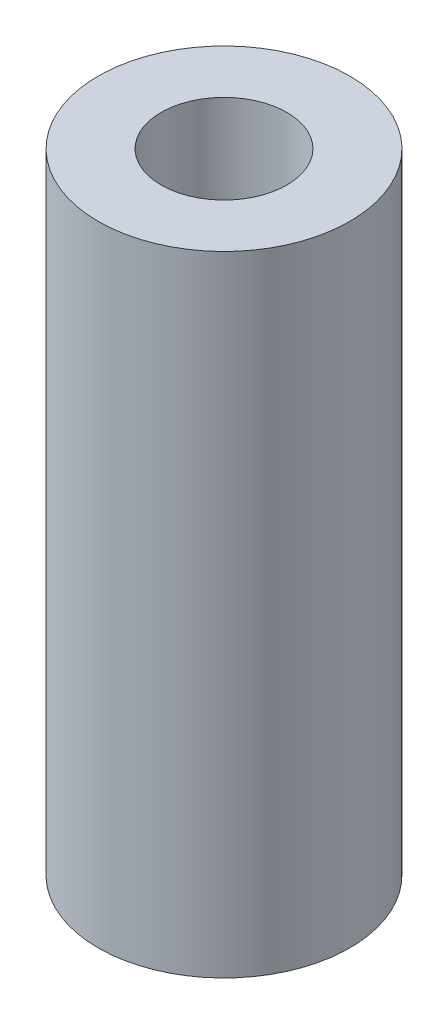
ISO-10303-21;
HEADER;
FILE_DESCRIPTION(('STEP AP214'),'2;1');
FILE_NAME('part.step','',(''),(''),'','','');
FILE_SCHEMA(('AUTOMOTIVE_DESIGN { 1 0 10303 214 1 1 1 1 }'));
ENDSEC;
DATA;
#1=APPLICATION_CONTEXT('core data for automotive mechanical design processes');
#2=APPLICATION_PROTOCOL_DEFINITION('international standard','automotive_design',2000,#1);
#3=PRODUCT_CONTEXT('',#1,'mechanical');
#4=PRODUCT('Part','Part','',(#3));
#5=PRODUCT_RELATED_PRODUCT_CATEGORY('part','',(#4));
#6=PRODUCT_DEFINITION_FORMATION('','',#4);
#7=PRODUCT_DEFINITION_CONTEXT('part definition',#1,'design');
#8=PRODUCT_DEFINITION('design','',#6,#7);
#9=PRODUCT_DEFINITION_SHAPE('','',#8);
#10=(LENGTH_UNIT() NAMED_UNIT(*) SI_UNIT(.MILLI.,.METRE.));
#11=(NAMED_UNIT(*) PLANE_ANGLE_UNIT() SI_UNIT($,.RADIAN.));
#12=(NAMED_UNIT(*) SI_UNIT($,.STERADIAN.) SOLID_ANGLE_UNIT());
#13=UNCERTAINTY_MEASURE_WITH_UNIT(LENGTH_MEASURE(1.E-05),#10,'distance_accuracy_value','');
#14=(GEOMETRIC_REPRESENTATION_CONTEXT(3) GLOBAL_UNCERTAINTY_ASSIGNED_CONTEXT((#13)) GLOBAL_UNIT_ASSIGNED_CONTEXT((#10,
#11,#12)) REPRESENTATION_CONTEXT('',''));
#15=CARTESIAN_POINT('',(0.,0.,0.));
#16=DIRECTION('',(0.,0.,1.));
#17=DIRECTION('',(1.,0.,0.));
#18=AXIS2_PLACEMENT_3D('',#15,#16,#17);
#19=CARTESIAN_POINT('',(-11.6487041207298,20.,0.39291263899287));
#20=DIRECTION('',(0.,1.,0.));
#21=DIRECTION('',(0.,0.,1.));
#22=AXIS2_PLACEMENT_3D('',#19,#20,#21);
#23=PLANE('',#22);
#24=CARTESIAN_POINT('',(-11.6487041207298,20.,0.39291263899287));
#25=DIRECTION('',(0.,1.,0.));
#26=DIRECTION('',(0.,0.,1.));
#27=AXIS2_PLACEMENT_3D('',#24,#25,#26);
#28=CIRCLE('',#27,4.);
#29=CARTESIAN_POINT('',(-11.6487041207298,20.,4.39291263899287));
#30=VERTEX_POINT('',#29);
#31=EDGE_CURVE('E10',#30,#30,#28,.T.);
#32=ORIENTED_EDGE('',*,*,#31,.T.);
#33=EDGE_LOOP('',(#32));
#34=FACE_BOUND('',#33,.T.);
#35=CARTESIAN_POINT('',(-11.6487041207298,20.,0.39291263899287));
#36=DIRECTION('',(0.,1.,0.));
#37=DIRECTION('',(0.,0.,1.));
#38=AXIS2_PLACEMENT_3D('',#35,#36,#37);
#39=CIRCLE('',#38,2.);
#40=CARTESIAN_POINT('',(-11.6487041207298,20.,2.39291263899287));
#41=VERTEX_POINT('',#40);
#42=EDGE_CURVE('E42',#41,#41,#39,.T.);
#43=ORIENTED_EDGE('',*,*,#42,.F.);
#44=EDGE_LOOP('',(#43));
#45=FACE_BOUND('',#44,.T.);
#46=ADVANCED_FACE('F31',(#34,#45),#23,.T.);
#47=CARTESIAN_POINT('',(-11.6487041207298,0.,0.39291263899287));
#48=DIRECTION('',(0.,1.,0.));
#49=DIRECTION('',(0.,0.,1.));
#50=AXIS2_PLACEMENT_3D('',#47,#48,#49);
#51=PLANE('',#50);
#52=CARTESIAN_POINT('',(-11.6487041207298,0.,0.39291263899287));
#53=DIRECTION('',(0.,1.,0.));
#54=DIRECTION('',(0.,0.,1.));
#55=AXIS2_PLACEMENT_3D('',#52,#53,#54);
#56=CIRCLE('',#55,4.);
#57=CARTESIAN_POINT('',(-11.6487041207298,0.,4.39291263899287));
#58=VERTEX_POINT('',#57);
#59=EDGE_CURVE('E35',#58,#58,#56,.T.);
#60=ORIENTED_EDGE('',*,*,#59,.F.);
#61=EDGE_LOOP('',(#60));
#62=FACE_BOUND('',#61,.T.);
#63=CARTESIAN_POINT('',(-11.6487041207298,0.,0.39291263899287));
#64=DIRECTION('',(0.,1.,0.));
#65=DIRECTION('',(0.,0.,1.));
#66=AXIS2_PLACEMENT_3D('',#63,#64,#65);
#67=CIRCLE('',#66,2.);
#68=CARTESIAN_POINT('',(-11.6487041207298,0.,2.39291263899287));
#69=VERTEX_POINT('',#68);
#70=EDGE_CURVE('E44',#69,#69,#67,.T.);
#71=ORIENTED_EDGE('',*,*,#70,.T.);
#72=EDGE_LOOP('',(#71));
#73=FACE_BOUND('',#72,.T.);
#74=ADVANCED_FACE('F54',(#62,#73),#51,.F.);
#75=CARTESIAN_POINT('',(-11.6487041207298,20.,0.39291263899287));
#76=DIRECTION('',(0.,-1.,0.));
#77=DIRECTION('',(0.,0.,-1.));
#78=AXIS2_PLACEMENT_3D('',#75,#76,#77);
#79=CYLINDRICAL_SURFACE('',#78,4.);
#80=ORIENTED_EDGE('',*,*,#31,.F.);
#81=EDGE_LOOP('',(#80));
#82=FACE_BOUND('',#81,.T.);
#83=ORIENTED_EDGE('',*,*,#59,.T.);
#84=EDGE_LOOP('',(#83));
#85=FACE_BOUND('',#84,.T.);
#86=ADVANCED_FACE('F33',(#82,#85),#79,.T.);
#87=CARTESIAN_POINT('',(-11.6487041207298,20.,0.39291263899287));
#88=DIRECTION('',(0.,-1.,0.));
#89=DIRECTION('',(0.,0.,-1.));
#90=AXIS2_PLACEMENT_3D('',#87,#88,#89);
#91=CYLINDRICAL_SURFACE('',#90,2.);
#92=ORIENTED_EDGE('',*,*,#42,.T.);
#93=EDGE_LOOP('',(#92));
#94=FACE_BOUND('',#93,.T.);
#95=ORIENTED_EDGE('',*,*,#70,.F.);
#96=EDGE_LOOP('',(#95));
#97=FACE_BOUND('',#96,.T.);
#98=ADVANCED_FACE('F50',(#94,#97),#91,.F.);
#99=CLOSED_SHELL('',(#46,#74,#86,#98));
#100=MANIFOLD_SOLID_BREP('B2',#99);
#101=ADVANCED_BREP_SHAPE_REPRESENTATION('',(#18,#100),#14);
#102=SHAPE_DEFINITION_REPRESENTATION(#9,#101);
ENDSEC;
END-ISO-10303-21;
